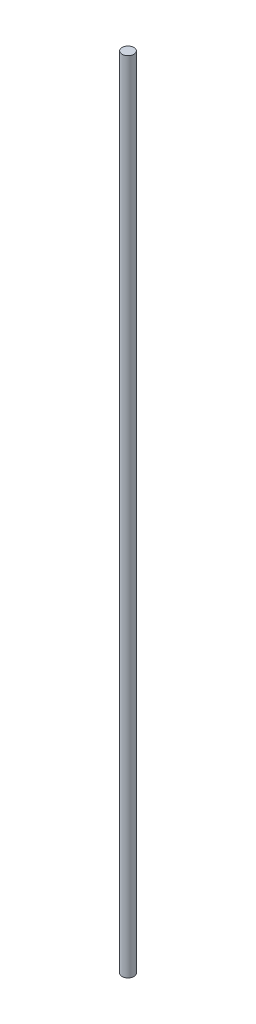
ISO-10303-21;
HEADER;
FILE_DESCRIPTION(('STEP AP214'),'2;1');
FILE_NAME('part.step','',(''),(''),'','','');
FILE_SCHEMA(('AUTOMOTIVE_DESIGN { 1 0 10303 214 1 1 1 1 }'));
ENDSEC;
DATA;
#1=APPLICATION_CONTEXT('core data for automotive mechanical design processes');
#2=APPLICATION_PROTOCOL_DEFINITION('international standard','automotive_design',2000,#1);
#3=PRODUCT_CONTEXT('',#1,'mechanical');
#4=PRODUCT('Part','Part','',(#3));
#5=PRODUCT_RELATED_PRODUCT_CATEGORY('part','',(#4));
#6=PRODUCT_DEFINITION_FORMATION('','',#4);
#7=PRODUCT_DEFINITION_CONTEXT('part definition',#1,'design');
#8=PRODUCT_DEFINITION('design','',#6,#7);
#9=PRODUCT_DEFINITION_SHAPE('','',#8);
#10=(LENGTH_UNIT() NAMED_UNIT(*) SI_UNIT(.MILLI.,.METRE.));
#11=(NAMED_UNIT(*) PLANE_ANGLE_UNIT() SI_UNIT($,.RADIAN.));
#12=(NAMED_UNIT(*) SI_UNIT($,.STERADIAN.) SOLID_ANGLE_UNIT());
#13=UNCERTAINTY_MEASURE_WITH_UNIT(LENGTH_MEASURE(1.E-05),#10,'distance_accuracy_value','');
#14=(GEOMETRIC_REPRESENTATION_CONTEXT(3) GLOBAL_UNCERTAINTY_ASSIGNED_CONTEXT((#13)) GLOBAL_UNIT_ASSIGNED_CONTEXT((#10,
#11,#12)) REPRESENTATION_CONTEXT('',''));
#15=CARTESIAN_POINT('',(0.,0.,0.));
#16=DIRECTION('',(0.,0.,1.));
#17=DIRECTION('',(1.,0.,0.));
#18=AXIS2_PLACEMENT_3D('',#15,#16,#17);
#19=CARTESIAN_POINT('',(0.,135.,0.));
#20=DIRECTION('',(0.,-1.,0.));
#21=DIRECTION('',(0.,0.,-1.));
#22=AXIS2_PLACEMENT_3D('',#19,#20,#21);
#23=CYLINDRICAL_SURFACE('',#22,1.);
#24=CARTESIAN_POINT('',(0.,135.,0.));
#25=DIRECTION('',(0.,1.,0.));
#26=DIRECTION('',(0.,0.,1.));
#27=AXIS2_PLACEMENT_3D('',#24,#25,#26);
#28=CIRCLE('',#27,1.);
#29=CARTESIAN_POINT('',(0.,135.,1.));
#30=VERTEX_POINT('',#29);
#31=EDGE_CURVE('E12',#30,#30,#28,.T.);
#32=ORIENTED_EDGE('',*,*,#31,.F.);
#33=EDGE_LOOP('',(#32));
#34=FACE_BOUND('',#33,.T.);
#35=CARTESIAN_POINT('',(0.,0.,0.));
#36=DIRECTION('',(0.,1.,0.));
#37=DIRECTION('',(0.,0.,1.));
#38=AXIS2_PLACEMENT_3D('',#35,#36,#37);
#39=CIRCLE('',#38,1.);
#40=CARTESIAN_POINT('',(0.,0.,1.));
#41=VERTEX_POINT('',#40);
#42=EDGE_CURVE('E44',#41,#41,#39,.T.);
#43=ORIENTED_EDGE('',*,*,#42,.T.);
#44=EDGE_LOOP('',(#43));
#45=FACE_BOUND('',#44,.T.);
#46=ADVANCED_FACE('F41',(#34,#45),#23,.T.);
#47=CARTESIAN_POINT('',(0.,135.,0.));
#48=DIRECTION('',(0.,1.,0.));
#49=DIRECTION('',(0.,0.,1.));
#50=AXIS2_PLACEMENT_3D('',#47,#48,#49);
#51=PLANE('',#50);
#52=ORIENTED_EDGE('',*,*,#31,.T.);
#53=EDGE_LOOP('',(#52));
#54=FACE_BOUND('',#53,.T.);
#55=ADVANCED_FACE('F56',(#54),#51,.T.);
#56=CARTESIAN_POINT('',(0.,0.,0.));
#57=DIRECTION('',(0.,1.,0.));
#58=DIRECTION('',(0.,0.,1.));
#59=AXIS2_PLACEMENT_3D('',#56,#57,#58);
#60=PLANE('',#59);
#61=ORIENTED_EDGE('',*,*,#42,.F.);
#62=EDGE_LOOP('',(#61));
#63=FACE_BOUND('',#62,.T.);
#64=ADVANCED_FACE('F54',(#63),#60,.F.);
#65=CLOSED_SHELL('',(#46,#55,#64));
#66=MANIFOLD_SOLID_BREP('B2',#65);
#67=ADVANCED_BREP_SHAPE_REPRESENTATION('',(#18,#66),#14);
#68=SHAPE_DEFINITION_REPRESENTATION(#9,#67);
ENDSEC;
END-ISO-10303-21;
